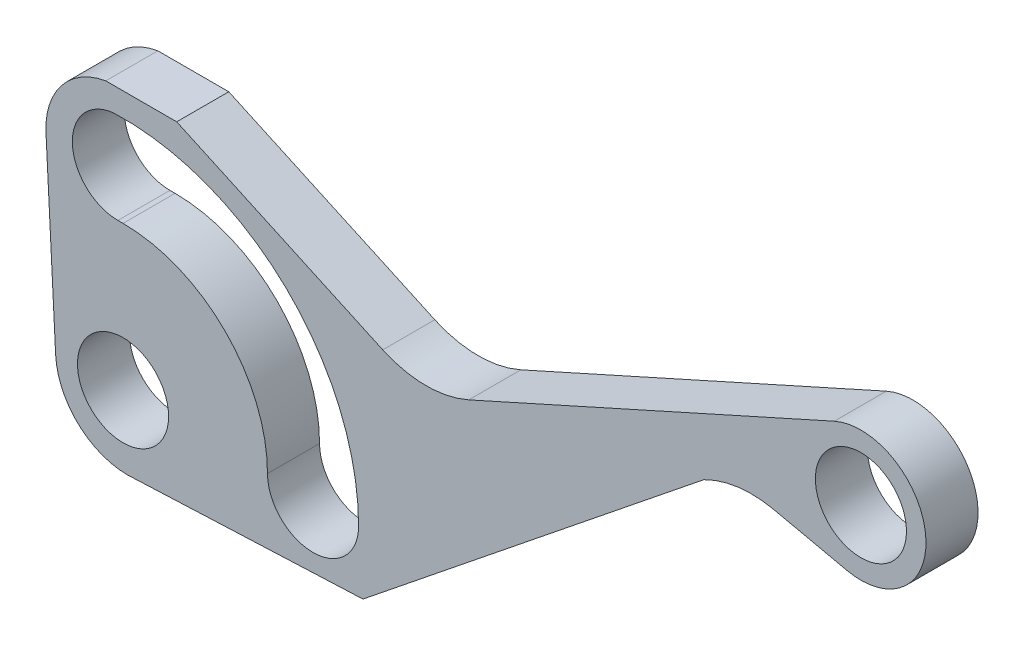
ISO-10303-21;
HEADER;
FILE_DESCRIPTION(('STEP AP214'),'2;1');
FILE_NAME('part.step','',(''),(''),'','','');
FILE_SCHEMA(('AUTOMOTIVE_DESIGN { 1 0 10303 214 1 1 1 1 }'));
ENDSEC;
DATA;
#1=APPLICATION_CONTEXT('core data for automotive mechanical design processes');
#2=APPLICATION_PROTOCOL_DEFINITION('international standard','automotive_design',2000,#1);
#3=PRODUCT_CONTEXT('',#1,'mechanical');
#4=PRODUCT('Part','Part','',(#3));
#5=PRODUCT_RELATED_PRODUCT_CATEGORY('part','',(#4));
#6=PRODUCT_DEFINITION_FORMATION('','',#4);
#7=PRODUCT_DEFINITION_CONTEXT('part definition',#1,'design');
#8=PRODUCT_DEFINITION('design','',#6,#7);
#9=PRODUCT_DEFINITION_SHAPE('','',#8);
#10=(LENGTH_UNIT() NAMED_UNIT(*) SI_UNIT(.MILLI.,.METRE.));
#11=(NAMED_UNIT(*) PLANE_ANGLE_UNIT() SI_UNIT($,.RADIAN.));
#12=(NAMED_UNIT(*) SI_UNIT($,.STERADIAN.) SOLID_ANGLE_UNIT());
#13=UNCERTAINTY_MEASURE_WITH_UNIT(LENGTH_MEASURE(1.E-05),#10,'distance_accuracy_value','');
#14=(GEOMETRIC_REPRESENTATION_CONTEXT(3) GLOBAL_UNCERTAINTY_ASSIGNED_CONTEXT((#13)) GLOBAL_UNIT_ASSIGNED_CONTEXT((#10,
#11,#12)) REPRESENTATION_CONTEXT('',''));
#15=CARTESIAN_POINT('',(0.,0.,0.));
#16=DIRECTION('',(0.,0.,1.));
#17=DIRECTION('',(1.,0.,0.));
#18=AXIS2_PLACEMENT_3D('',#15,#16,#17);
#19=CARTESIAN_POINT('',(-10.278907768874,-4.48742178779802,3.));
#20=DIRECTION('',(0.,0.,-1.));
#21=DIRECTION('',(-1.,0.,0.));
#22=AXIS2_PLACEMENT_3D('',#19,#20,#21);
#23=CYLINDRICAL_SURFACE('',#22,18.0994140174849);
#24=CARTESIAN_POINT('',(-10.278907768874,-4.48742178779802,-1.));
#25=DIRECTION('',(0.,0.,1.));
#26=DIRECTION('',(1.,0.,0.));
#27=AXIS2_PLACEMENT_3D('',#24,#25,#26);
#28=CIRCLE('',#27,18.0994140174849);
#29=CARTESIAN_POINT('',(7.82036578510986,-4.41611544594141,-1.));
#30=VERTEX_POINT('',#29);
#31=CARTESIAN_POINT('',(-10.9936081008676,13.5978758655937,-1.));
#32=VERTEX_POINT('',#31);
#33=EDGE_CURVE('E232',#30,#32,#28,.T.);
#34=ORIENTED_EDGE('',*,*,#33,.F.);
#35=DIRECTION('',(0.,0.,-1.));
#36=VECTOR('',#35,1.);
#37=CARTESIAN_POINT('',(7.82036578510986,-4.41611544594141,3.));
#38=LINE('',#37,#36);
#39=CARTESIAN_POINT('',(7.82036578510986,-4.41611544594141,3.));
#40=VERTEX_POINT('',#39);
#41=EDGE_CURVE('E11',#40,#30,#38,.T.);
#42=ORIENTED_EDGE('',*,*,#41,.F.);
#43=CARTESIAN_POINT('',(-10.278907768874,-4.48742178779802,3.));
#44=DIRECTION('',(0.,0.,1.));
#45=DIRECTION('',(1.,0.,0.));
#46=AXIS2_PLACEMENT_3D('',#43,#44,#45);
#47=CIRCLE('',#46,18.0994140174849);
#48=CARTESIAN_POINT('',(-10.9936081008676,13.5978758655937,3.));
#49=VERTEX_POINT('',#48);
#50=EDGE_CURVE('E529',#40,#49,#47,.T.);
#51=ORIENTED_EDGE('',*,*,#50,.T.);
#52=DIRECTION('',(0.,0.,-1.));
#53=VECTOR('',#52,1.);
#54=CARTESIAN_POINT('',(-10.9936081008676,13.5978758655937,3.));
#55=LINE('',#54,#53);
#56=EDGE_CURVE('E56',#49,#32,#55,.T.);
#57=ORIENTED_EDGE('',*,*,#56,.T.);
#58=EDGE_LOOP('',(#34,#42,#51,#57));
#59=FACE_BOUND('',#58,.T.);
#60=ADVANCED_FACE('F37',(#59),#23,.F.);
#61=CARTESIAN_POINT('',(4.32109223112603,-4.48742178779802,3.));
#62=DIRECTION('',(0.,0.,-1.));
#63=DIRECTION('',(-1.,0.,0.));
#64=AXIS2_PLACEMENT_3D('',#61,#62,#63);
#65=CYLINDRICAL_SURFACE('',#64,3.49999999999994);
#66=CARTESIAN_POINT('',(4.32109223112603,-4.48742178779802,-1.));
#67=DIRECTION('',(0.,0.,1.));
#68=DIRECTION('',(1.,0.,0.));
#69=AXIS2_PLACEMENT_3D('',#66,#67,#68);
#70=CIRCLE('',#69,3.49999999999994);
#71=CARTESIAN_POINT('',(0.821092231126088,-4.48742178779802,-1.));
#72=VERTEX_POINT('',#71);
#73=EDGE_CURVE('E234',#72,#30,#70,.T.);
#74=ORIENTED_EDGE('',*,*,#73,.F.);
#75=DIRECTION('',(0.,0.,-1.));
#76=VECTOR('',#75,1.);
#77=CARTESIAN_POINT('',(0.821092231126088,-4.48742178779802,3.));
#78=LINE('',#77,#76);
#79=CARTESIAN_POINT('',(0.821092231126088,-4.48742178779802,3.));
#80=VERTEX_POINT('',#79);
#81=EDGE_CURVE('E47',#80,#72,#78,.T.);
#82=ORIENTED_EDGE('',*,*,#81,.F.);
#83=CARTESIAN_POINT('',(4.32109223112603,-4.48742178779802,3.));
#84=DIRECTION('',(0.,0.,1.));
#85=DIRECTION('',(1.,0.,0.));
#86=AXIS2_PLACEMENT_3D('',#83,#84,#85);
#87=CIRCLE('',#86,3.49999999999994);
#88=EDGE_CURVE('E173',#80,#40,#87,.T.);
#89=ORIENTED_EDGE('',*,*,#88,.T.);
#90=ORIENTED_EDGE('',*,*,#41,.T.);
#91=EDGE_LOOP('',(#74,#82,#89,#90));
#92=FACE_BOUND('',#91,.T.);
#93=ADVANCED_FACE('F343',(#92),#65,.F.);
#94=CARTESIAN_POINT('',(-10.278907768874,-4.48742178779802,3.));
#95=DIRECTION('',(0.,0.,-1.));
#96=DIRECTION('',(-1.,0.,0.));
#97=AXIS2_PLACEMENT_3D('',#94,#95,#96);
#98=CYLINDRICAL_SURFACE('',#97,11.1000000000001);
#99=CARTESIAN_POINT('',(-10.278907768874,-4.48742178779802,-1.));
#100=DIRECTION('',(0.,0.,1.));
#101=DIRECTION('',(1.,0.,0.));
#102=AXIS2_PLACEMENT_3D('',#99,#100,#101);
#103=CIRCLE('',#102,11.1000000000001);
#104=CARTESIAN_POINT('',(-10.2789077688739,6.61257821220198,-1.));
#105=VERTEX_POINT('',#104);
#106=EDGE_CURVE('E180',#72,#105,#103,.T.);
#107=ORIENTED_EDGE('',*,*,#106,.T.);
#108=DIRECTION('',(0.,0.,-1.));
#109=VECTOR('',#108,1.);
#110=CARTESIAN_POINT('',(-10.2789077688739,6.61257821220198,3.));
#111=LINE('',#110,#109);
#112=CARTESIAN_POINT('',(-10.2789077688739,6.61257821220198,3.));
#113=VERTEX_POINT('',#112);
#114=EDGE_CURVE('E177',#113,#105,#111,.T.);
#115=ORIENTED_EDGE('',*,*,#114,.F.);
#116=CARTESIAN_POINT('',(-10.278907768874,-4.48742178779802,3.));
#117=DIRECTION('',(0.,0.,1.));
#118=DIRECTION('',(1.,0.,0.));
#119=AXIS2_PLACEMENT_3D('',#116,#117,#118);
#120=CIRCLE('',#119,11.1000000000001);
#121=EDGE_CURVE('E164',#80,#113,#120,.T.);
#122=ORIENTED_EDGE('',*,*,#121,.F.);
#123=ORIENTED_EDGE('',*,*,#81,.T.);
#124=EDGE_LOOP('',(#107,#115,#122,#123));
#125=FACE_BOUND('',#124,.T.);
#126=ADVANCED_FACE('F178',(#125),#98,.T.);
#127=CARTESIAN_POINT('',(-10.2789077688739,6.61257821220198,3.));
#128=DIRECTION('',(0.,1.,0.));
#129=DIRECTION('',(-1.,0.,0.));
#130=AXIS2_PLACEMENT_3D('',#127,#128,#129);
#131=PLANE('',#130);
#132=DIRECTION('',(1.,0.,0.));
#133=VECTOR('',#132,1.);
#134=CARTESIAN_POINT('',(-10.2789077688739,6.61257821220198,-1.));
#135=LINE('',#134,#133);
#136=CARTESIAN_POINT('',(-10.6731392767024,6.61257821220198,-1.));
#137=VERTEX_POINT('',#136);
#138=EDGE_CURVE('E238',#137,#105,#135,.T.);
#139=ORIENTED_EDGE('',*,*,#138,.F.);
#140=DIRECTION('',(0.,0.,-1.));
#141=VECTOR('',#140,1.);
#142=CARTESIAN_POINT('',(-10.6731392767024,6.61257821220198,3.));
#143=LINE('',#142,#141);
#144=CARTESIAN_POINT('',(-10.6731392767024,6.61257821220198,3.));
#145=VERTEX_POINT('',#144);
#146=EDGE_CURVE('E108',#145,#137,#143,.T.);
#147=ORIENTED_EDGE('',*,*,#146,.F.);
#148=DIRECTION('',(1.,0.,0.));
#149=VECTOR('',#148,1.);
#150=CARTESIAN_POINT('',(-10.2789077688739,6.61257821220198,3.));
#151=LINE('',#150,#149);
#152=EDGE_CURVE('E171',#145,#113,#151,.T.);
#153=ORIENTED_EDGE('',*,*,#152,.T.);
#154=ORIENTED_EDGE('',*,*,#114,.T.);
#155=EDGE_LOOP('',(#139,#147,#153,#154));
#156=FACE_BOUND('',#155,.T.);
#157=ADVANCED_FACE('F184',(#156),#131,.T.);
#158=CARTESIAN_POINT('',(-10.6780760391979,9.98460003114458,3.));
#159=DIRECTION('',(0.,0.,-1.));
#160=DIRECTION('',(-1.,0.,0.));
#161=AXIS2_PLACEMENT_3D('',#158,#159,#160);
#162=CYLINDRICAL_SURFACE('',#161,5.5274829677151);
#163=CARTESIAN_POINT('',(-10.6780760391979,9.98460003114458,-1.));
#164=DIRECTION('',(0.,0.,1.));
#165=DIRECTION('',(1.,0.,0.));
#166=AXIS2_PLACEMENT_3D('',#163,#164,#165);
#167=CIRCLE('',#166,5.5274829677151);
#168=CARTESIAN_POINT('',(-16.1982813937467,9.70104967937128,-1.));
#169=VERTEX_POINT('',#168);
#170=CARTESIAN_POINT('',(-11.6043072413043,15.4339269362426,-1.));
#171=VERTEX_POINT('',#170);
#172=EDGE_CURVE('E197',#169,#171,#167,.F.);
#173=ORIENTED_EDGE('',*,*,#172,.F.);
#174=DIRECTION('',(0.,0.,-1.));
#175=VECTOR('',#174,1.);
#176=CARTESIAN_POINT('',(-16.1982813937467,9.70104967937128,3.));
#177=LINE('',#176,#175);
#178=CARTESIAN_POINT('',(-16.1982813937467,9.70104967937128,3.));
#179=VERTEX_POINT('',#178);
#180=EDGE_CURVE('E41',#179,#169,#177,.T.);
#181=ORIENTED_EDGE('',*,*,#180,.F.);
#182=CARTESIAN_POINT('',(-10.6780760391979,9.98460003114458,3.));
#183=DIRECTION('',(0.,0.,1.));
#184=DIRECTION('',(1.,0.,0.));
#185=AXIS2_PLACEMENT_3D('',#182,#183,#184);
#186=CIRCLE('',#185,5.5274829677151);
#187=CARTESIAN_POINT('',(-11.6043072413043,15.4339269362426,3.));
#188=VERTEX_POINT('',#187);
#189=EDGE_CURVE('E249',#179,#188,#186,.F.);
#190=ORIENTED_EDGE('',*,*,#189,.T.);
#191=DIRECTION('',(0.,0.,-1.));
#192=VECTOR('',#191,1.);
#193=CARTESIAN_POINT('',(-11.6043072413043,15.4339269362426,3.));
#194=LINE('',#193,#192);
#195=EDGE_CURVE('E196',#188,#171,#194,.T.);
#196=ORIENTED_EDGE('',*,*,#195,.T.);
#197=EDGE_LOOP('',(#173,#181,#190,#196));
#198=FACE_BOUND('',#197,.T.);
#199=ADVANCED_FACE('F39',(#198),#162,.T.);
#200=CARTESIAN_POINT('',(-15.4558186424934,-4.75333850738242,3.));
#201=DIRECTION('',(0.998683376645616,0.051298276888317,0.));
#202=DIRECTION('',(-0.051298276888317,0.998683376645616,0.));
#203=AXIS2_PLACEMENT_3D('',#200,#201,#202);
#204=PLANE('',#203);
#205=DIRECTION('',(0.051298276888317,-0.998683376645616,0.));
#206=VECTOR('',#205,1.);
#207=CARTESIAN_POINT('',(-15.4558186424934,-4.75333850738242,-1.));
#208=LINE('',#207,#206);
#209=CARTESIAN_POINT('',(-15.4579295632633,-4.71224275114651,-1.));
#210=VERTEX_POINT('',#209);
#211=EDGE_CURVE('E200',#169,#210,#208,.T.);
#212=ORIENTED_EDGE('',*,*,#211,.T.);
#213=DIRECTION('',(0.,0.,-1.));
#214=VECTOR('',#213,1.);
#215=CARTESIAN_POINT('',(-15.4579295632633,-4.71224275114651,3.));
#216=LINE('',#215,#214);
#217=CARTESIAN_POINT('',(-15.4579295632633,-4.71224275114651,3.));
#218=VERTEX_POINT('',#217);
#219=EDGE_CURVE('E271',#218,#210,#216,.T.);
#220=ORIENTED_EDGE('',*,*,#219,.F.);
#221=DIRECTION('',(0.051298276888317,-0.998683376645616,0.));
#222=VECTOR('',#221,1.);
#223=CARTESIAN_POINT('',(-15.4558186424934,-4.75333850738242,3.));
#224=LINE('',#223,#222);
#225=EDGE_CURVE('E280',#179,#218,#224,.T.);
#226=ORIENTED_EDGE('',*,*,#225,.F.);
#227=ORIENTED_EDGE('',*,*,#180,.T.);
#228=EDGE_LOOP('',(#212,#220,#226,#227));
#229=FACE_BOUND('',#228,.T.);
#230=ADVANCED_FACE('F279',(#229),#204,.F.);
#231=CARTESIAN_POINT('',(-9.93772420871442,-4.4286923993732,3.));
#232=DIRECTION('',(0.,0.,-1.));
#233=DIRECTION('',(-1.,0.,0.));
#234=AXIS2_PLACEMENT_3D('',#231,#232,#233);
#235=CYLINDRICAL_SURFACE('',#234,5.5274829677151);
#236=CARTESIAN_POINT('',(-9.93772420871442,-4.4286923993732,-1.));
#237=DIRECTION('',(0.,0.,1.));
#238=DIRECTION('',(1.,0.,0.));
#239=AXIS2_PLACEMENT_3D('',#236,#237,#238);
#240=CIRCLE('',#239,5.5274829677151);
#241=CARTESIAN_POINT('',(-9.93772420871442,-9.9561753670883,-1.));
#242=VERTEX_POINT('',#241);
#243=EDGE_CURVE('E202',#210,#242,#240,.T.);
#244=ORIENTED_EDGE('',*,*,#243,.T.);
#245=DIRECTION('',(0.,0.,-1.));
#246=VECTOR('',#245,1.);
#247=CARTESIAN_POINT('',(-9.93772420871442,-9.9561753670883,3.));
#248=LINE('',#247,#246);
#249=CARTESIAN_POINT('',(-9.93772420871442,-9.9561753670883,3.));
#250=VERTEX_POINT('',#249);
#251=EDGE_CURVE('E270',#250,#242,#248,.T.);
#252=ORIENTED_EDGE('',*,*,#251,.F.);
#253=CARTESIAN_POINT('',(-9.93772420871442,-4.4286923993732,3.));
#254=DIRECTION('',(0.,0.,1.));
#255=DIRECTION('',(1.,0.,0.));
#256=AXIS2_PLACEMENT_3D('',#253,#254,#255);
#257=CIRCLE('',#256,5.5274829677151);
#258=EDGE_CURVE('E512',#218,#250,#257,.T.);
#259=ORIENTED_EDGE('',*,*,#258,.F.);
#260=ORIENTED_EDGE('',*,*,#219,.T.);
#261=EDGE_LOOP('',(#244,#252,#259,#260));
#262=FACE_BOUND('',#261,.T.);
#263=ADVANCED_FACE('F334',(#262),#235,.T.);
#264=CARTESIAN_POINT('',(-10.0414107976076,-9.96067456561297,3.));
#265=DIRECTION('',(0.0433514960330222,-0.999059881984908,0.));
#266=DIRECTION('',(0.999059881984908,0.0433514960330222,0.));
#267=AXIS2_PLACEMENT_3D('',#264,#265,#266);
#268=PLANE('',#267);
#269=DIRECTION('',(-0.999059881984908,-0.0433514960330222,0.));
#270=VECTOR('',#269,1.);
#271=CARTESIAN_POINT('',(-10.0414107976076,-9.96067456561297,-1.));
#272=LINE('',#271,#270);
#273=CARTESIAN_POINT('',(8.15797388959057,-9.17096158914652,-1.));
#274=VERTEX_POINT('',#273);
#275=EDGE_CURVE('E205',#274,#242,#272,.T.);
#276=ORIENTED_EDGE('',*,*,#275,.F.);
#277=DIRECTION('',(0.,0.,-1.));
#278=VECTOR('',#277,1.);
#279=CARTESIAN_POINT('',(8.15797388959057,-9.17096158914652,3.));
#280=LINE('',#279,#278);
#281=CARTESIAN_POINT('',(8.15797388959057,-9.17096158914652,3.));
#282=VERTEX_POINT('',#281);
#283=EDGE_CURVE('E268',#282,#274,#280,.T.);
#284=ORIENTED_EDGE('',*,*,#283,.F.);
#285=DIRECTION('',(-0.999059881984908,-0.0433514960330222,0.));
#286=VECTOR('',#285,1.);
#287=CARTESIAN_POINT('',(-10.0414107976076,-9.96067456561297,3.));
#288=LINE('',#287,#286);
#289=EDGE_CURVE('E333',#282,#250,#288,.T.);
#290=ORIENTED_EDGE('',*,*,#289,.T.);
#291=ORIENTED_EDGE('',*,*,#251,.T.);
#292=EDGE_LOOP('',(#276,#284,#290,#291));
#293=FACE_BOUND('',#292,.T.);
#294=ADVANCED_FACE('F331',(#293),#268,.T.);
#295=CARTESIAN_POINT('',(-0.760855518449474,-16.3357036979346,3.));
#296=DIRECTION('',(0.626275611930927,-0.779601730308844,0.));
#297=DIRECTION('',(0.779601730308844,0.626275611930927,0.));
#298=AXIS2_PLACEMENT_3D('',#295,#296,#297);
#299=PLANE('',#298);
#300=DIRECTION('',(-0.779601730308844,-0.626275611930927,0.));
#301=VECTOR('',#300,1.);
#302=CARTESIAN_POINT('',(-0.760855518449474,-16.3357036979346,-1.));
#303=LINE('',#302,#301);
#304=CARTESIAN_POINT('',(34.3571013194445,11.8755214101768,-1.));
#305=VERTEX_POINT('',#304);
#306=EDGE_CURVE('E208',#305,#274,#303,.T.);
#307=ORIENTED_EDGE('',*,*,#306,.F.);
#308=DIRECTION('',(0.,0.,-1.));
#309=VECTOR('',#308,1.);
#310=CARTESIAN_POINT('',(34.3571013194445,11.8755214101768,3.));
#311=LINE('',#310,#309);
#312=CARTESIAN_POINT('',(34.3571013194445,11.8755214101768,3.));
#313=VERTEX_POINT('',#312);
#314=EDGE_CURVE('E266',#313,#305,#311,.T.);
#315=ORIENTED_EDGE('',*,*,#314,.F.);
#316=DIRECTION('',(-0.779601730308844,-0.626275611930927,0.));
#317=VECTOR('',#316,1.);
#318=CARTESIAN_POINT('',(-0.760855518449474,-16.3357036979346,3.));
#319=LINE('',#318,#317);
#320=EDGE_CURVE('E327',#313,#282,#319,.T.);
#321=ORIENTED_EDGE('',*,*,#320,.T.);
#322=ORIENTED_EDGE('',*,*,#283,.T.);
#323=EDGE_LOOP('',(#307,#315,#321,#322));
#324=FACE_BOUND('',#323,.T.);
#325=ADVANCED_FACE('F324',(#324),#299,.T.);
#326=CARTESIAN_POINT('',(38.0079075036656,4.75712171605639,3.));
#327=DIRECTION('',(0.,0.,-1.));
#328=DIRECTION('',(-1.,0.,0.));
#329=AXIS2_PLACEMENT_3D('',#326,#327,#328);
#330=CYLINDRICAL_SURFACE('',#329,8.);
#331=CARTESIAN_POINT('',(38.0079075036656,4.75712171605639,-1.));
#332=DIRECTION('',(0.,0.,1.));
#333=DIRECTION('',(1.,0.,0.));
#334=AXIS2_PLACEMENT_3D('',#331,#332,#333);
#335=CIRCLE('',#334,8.);
#336=CARTESIAN_POINT('',(39.7328067304173,12.5689539376003,-1.));
#337=VERTEX_POINT('',#336);
#338=EDGE_CURVE('E211',#337,#305,#335,.T.);
#339=ORIENTED_EDGE('',*,*,#338,.F.);
#340=DIRECTION('',(0.,0.,-1.));
#341=VECTOR('',#340,1.);
#342=CARTESIAN_POINT('',(39.7328067304173,12.5689539376003,3.));
#343=LINE('',#342,#341);
#344=CARTESIAN_POINT('',(39.7328067304173,12.5689539376003,3.));
#345=VERTEX_POINT('',#344);
#346=EDGE_CURVE('E264',#345,#337,#343,.T.);
#347=ORIENTED_EDGE('',*,*,#346,.F.);
#348=CARTESIAN_POINT('',(38.0079075036656,4.75712171605639,3.));
#349=DIRECTION('',(0.,0.,1.));
#350=DIRECTION('',(1.,0.,0.));
#351=AXIS2_PLACEMENT_3D('',#348,#349,#350);
#352=CIRCLE('',#351,8.);
#353=EDGE_CURVE('E518',#345,#313,#352,.T.);
#354=ORIENTED_EDGE('',*,*,#353,.T.);
#355=ORIENTED_EDGE('',*,*,#314,.T.);
#356=EDGE_LOOP('',(#339,#347,#354,#355));
#357=FACE_BOUND('',#356,.T.);
#358=ADVANCED_FACE('F320',(#357),#330,.F.);
#359=CARTESIAN_POINT('',(-4.36286152251806,22.3055409399199,3.));
#360=DIRECTION('',(-0.215612403343958,-0.976479027692987,0.));
#361=DIRECTION('',(0.976479027692988,-0.215612403343958,0.));
#362=AXIS2_PLACEMENT_3D('',#359,#360,#361);
#363=PLANE('',#362);
#364=DIRECTION('',(-0.976479027692988,0.215612403343958,0.));
#365=VECTOR('',#364,1.);
#366=CARTESIAN_POINT('',(-4.36286152251806,22.3055409399199,-1.));
#367=LINE('',#366,#365);
#368=CARTESIAN_POINT('',(45.3430302144062,11.330183073737,-1.));
#369=VERTEX_POINT('',#368);
#370=EDGE_CURVE('E214',#369,#337,#367,.T.);
#371=ORIENTED_EDGE('',*,*,#370,.F.);
#372=DIRECTION('',(0.,0.,-1.));
#373=VECTOR('',#372,1.);
#374=CARTESIAN_POINT('',(45.3430302144062,11.330183073737,3.));
#375=LINE('',#374,#373);
#376=CARTESIAN_POINT('',(45.3430302144062,11.330183073737,3.));
#377=VERTEX_POINT('',#376);
#378=EDGE_CURVE('E262',#377,#369,#375,.T.);
#379=ORIENTED_EDGE('',*,*,#378,.F.);
#380=DIRECTION('',(-0.976479027692988,0.215612403343958,0.));
#381=VECTOR('',#380,1.);
#382=CARTESIAN_POINT('',(-4.36286152251806,22.3055409399199,3.));
#383=LINE('',#382,#381);
#384=EDGE_CURVE('E316',#377,#345,#383,.T.);
#385=ORIENTED_EDGE('',*,*,#384,.T.);
#386=ORIENTED_EDGE('',*,*,#346,.T.);
#387=EDGE_LOOP('',(#371,#379,#385,#386));
#388=FACE_BOUND('',#387,.T.);
#389=ADVANCED_FACE('F311',(#388),#363,.T.);
#390=CARTESIAN_POINT('',(46.421092231126,16.212578212202,3.));
#391=DIRECTION('',(0.,0.,-1.));
#392=DIRECTION('',(-1.,0.,0.));
#393=AXIS2_PLACEMENT_3D('',#390,#391,#392);
#394=CYLINDRICAL_SURFACE('',#393,5.);
#395=CARTESIAN_POINT('',(46.421092231126,16.212578212202,-1.));
#396=DIRECTION('',(0.,0.,1.));
#397=DIRECTION('',(1.,0.,0.));
#398=AXIS2_PLACEMENT_3D('',#395,#396,#397);
#399=CIRCLE('',#398,5.);
#400=CARTESIAN_POINT('',(44.3714450279444,20.7731643962895,-1.));
#401=VERTEX_POINT('',#400);
#402=EDGE_CURVE('E217',#369,#401,#399,.T.);
#403=ORIENTED_EDGE('',*,*,#402,.T.);
#404=DIRECTION('',(0.,0.,-1.));
#405=VECTOR('',#404,1.);
#406=CARTESIAN_POINT('',(44.3714450279444,20.7731643962895,3.));
#407=LINE('',#406,#405);
#408=CARTESIAN_POINT('',(44.3714450279444,20.7731643962895,3.));
#409=VERTEX_POINT('',#408);
#410=EDGE_CURVE('E260',#409,#401,#407,.T.);
#411=ORIENTED_EDGE('',*,*,#410,.F.);
#412=CARTESIAN_POINT('',(46.421092231126,16.212578212202,3.));
#413=DIRECTION('',(0.,0.,1.));
#414=DIRECTION('',(1.,0.,0.));
#415=AXIS2_PLACEMENT_3D('',#412,#413,#414);
#416=CIRCLE('',#415,5.);
#417=EDGE_CURVE('E521',#377,#409,#416,.T.);
#418=ORIENTED_EDGE('',*,*,#417,.F.);
#419=ORIENTED_EDGE('',*,*,#378,.T.);
#420=EDGE_LOOP('',(#403,#411,#418,#419));
#421=FACE_BOUND('',#420,.T.);
#422=ADVANCED_FACE('F364',(#421),#394,.T.);
#423=CARTESIAN_POINT('',(-10.5403720465675,-3.90564831447509,3.));
#424=DIRECTION('',(-0.409929440636329,0.912117236817497,0.));
#425=DIRECTION('',(-0.912117236817497,-0.409929440636329,0.));
#426=AXIS2_PLACEMENT_3D('',#423,#424,#425);
#427=PLANE('',#426);
#428=DIRECTION('',(0.912117236817497,0.409929440636329,0.));
#429=VECTOR('',#428,1.);
#430=CARTESIAN_POINT('',(-10.5403720465675,-3.90564831447509,-1.));
#431=LINE('',#430,#429);
#432=CARTESIAN_POINT('',(16.2912352779306,8.15318068023005,-1.));
#433=VERTEX_POINT('',#432);
#434=EDGE_CURVE('E220',#433,#401,#431,.T.);
#435=ORIENTED_EDGE('',*,*,#434,.F.);
#436=DIRECTION('',(0.,0.,-1.));
#437=VECTOR('',#436,1.);
#438=CARTESIAN_POINT('',(16.2912352779306,8.15318068023005,3.));
#439=LINE('',#438,#437);
#440=CARTESIAN_POINT('',(16.2912352779306,8.15318068023005,3.));
#441=VERTEX_POINT('',#440);
#442=EDGE_CURVE('E258',#441,#433,#439,.T.);
#443=ORIENTED_EDGE('',*,*,#442,.F.);
#444=DIRECTION('',(0.912117236817497,0.409929440636329,0.));
#445=VECTOR('',#444,1.);
#446=CARTESIAN_POINT('',(-10.5403720465675,-3.90564831447509,3.));
#447=LINE('',#446,#445);
#448=EDGE_CURVE('E523',#441,#409,#447,.T.);
#449=ORIENTED_EDGE('',*,*,#448,.T.);
#450=ORIENTED_EDGE('',*,*,#410,.T.);
#451=EDGE_LOOP('',(#435,#443,#449,#450));
#452=FACE_BOUND('',#451,.T.);
#453=ADVANCED_FACE('F305',(#452),#427,.T.);
#454=CARTESIAN_POINT('',(13.01179975284,15.45011857477,3.));
#455=DIRECTION('',(0.,0.,-1.));
#456=DIRECTION('',(-1.,0.,0.));
#457=AXIS2_PLACEMENT_3D('',#454,#455,#456);
#458=CYLINDRICAL_SURFACE('',#457,8.);
#459=CARTESIAN_POINT('',(13.01179975284,15.45011857477,-1.));
#460=DIRECTION('',(0.,0.,1.));
#461=DIRECTION('',(1.,0.,0.));
#462=AXIS2_PLACEMENT_3D('',#459,#460,#461);
#463=CIRCLE('',#462,8.);
#464=CARTESIAN_POINT('',(9.67868684934687,8.17754280187029,-1.));
#465=VERTEX_POINT('',#464);
#466=EDGE_CURVE('E223',#465,#433,#463,.T.);
#467=ORIENTED_EDGE('',*,*,#466,.F.);
#468=DIRECTION('',(0.,0.,-1.));
#469=VECTOR('',#468,1.);
#470=CARTESIAN_POINT('',(9.67868684934687,8.17754280187029,3.));
#471=LINE('',#470,#469);
#472=CARTESIAN_POINT('',(9.67868684934687,8.17754280187029,3.));
#473=VERTEX_POINT('',#472);
#474=EDGE_CURVE('E256',#473,#465,#471,.T.);
#475=ORIENTED_EDGE('',*,*,#474,.F.);
#476=CARTESIAN_POINT('',(13.01179975284,15.45011857477,3.));
#477=DIRECTION('',(0.,0.,1.));
#478=DIRECTION('',(1.,0.,0.));
#479=AXIS2_PLACEMENT_3D('',#476,#477,#478);
#480=CIRCLE('',#479,8.);
#481=EDGE_CURVE('E301',#473,#441,#480,.T.);
#482=ORIENTED_EDGE('',*,*,#481,.T.);
#483=ORIENTED_EDGE('',*,*,#442,.T.);
#484=EDGE_LOOP('',(#467,#475,#482,#483));
#485=FACE_BOUND('',#484,.T.);
#486=ADVANCED_FACE('F296',(#485),#458,.F.);
#487=CARTESIAN_POINT('',(-2.01758793075363,13.5380925726442,3.));
#488=DIRECTION('',(-0.416639112936635,-0.909071971612465,0.));
#489=DIRECTION('',(0.909071971612465,-0.416639112936635,0.));
#490=AXIS2_PLACEMENT_3D('',#487,#488,#489);
#491=PLANE('',#490);
#492=DIRECTION('',(-0.909071971612465,0.416639112936635,0.));
#493=VECTOR('',#492,1.);
#494=CARTESIAN_POINT('',(-2.01758793075363,13.5380925726442,-1.));
#495=LINE('',#494,#493);
#496=CARTESIAN_POINT('',(-6.15414119532709,15.4339269362426,-1.));
#497=VERTEX_POINT('',#496);
#498=EDGE_CURVE('E226',#465,#497,#495,.T.);
#499=ORIENTED_EDGE('',*,*,#498,.T.);
#500=DIRECTION('',(0.,0.,-1.));
#501=VECTOR('',#500,1.);
#502=CARTESIAN_POINT('',(-6.15414119532709,15.4339269362426,3.));
#503=LINE('',#502,#501);
#504=CARTESIAN_POINT('',(-6.15414119532709,15.4339269362426,3.));
#505=VERTEX_POINT('',#504);
#506=EDGE_CURVE('E254',#505,#497,#503,.T.);
#507=ORIENTED_EDGE('',*,*,#506,.F.);
#508=DIRECTION('',(-0.909071971612465,0.416639112936635,0.));
#509=VECTOR('',#508,1.);
#510=CARTESIAN_POINT('',(-2.01758793075363,13.5380925726442,3.));
#511=LINE('',#510,#509);
#512=EDGE_CURVE('E526',#473,#505,#511,.T.);
#513=ORIENTED_EDGE('',*,*,#512,.F.);
#514=ORIENTED_EDGE('',*,*,#474,.T.);
#515=EDGE_LOOP('',(#499,#507,#513,#514));
#516=FACE_BOUND('',#515,.T.);
#517=ADVANCED_FACE('F356',(#516),#491,.F.);
#518=CARTESIAN_POINT('',(46.421092231126,16.212578212202,3.));
#519=DIRECTION('',(0.,0.,-1.));
#520=DIRECTION('',(-1.,0.,0.));
#521=AXIS2_PLACEMENT_3D('',#518,#519,#520);
#522=CYLINDRICAL_SURFACE('',#521,3.5);
#523=CARTESIAN_POINT('',(46.421092231126,16.212578212202,3.));
#524=DIRECTION('',(0.,0.,1.));
#525=DIRECTION('',(1.,0.,0.));
#526=AXIS2_PLACEMENT_3D('',#523,#524,#525);
#527=CIRCLE('',#526,3.5);
#528=CARTESIAN_POINT('',(49.921092231126,16.212578212202,3.));
#529=VERTEX_POINT('',#528);
#530=EDGE_CURVE('E187',#529,#529,#527,.T.);
#531=ORIENTED_EDGE('',*,*,#530,.T.);
#532=EDGE_LOOP('',(#531));
#533=FACE_BOUND('',#532,.T.);
#534=CARTESIAN_POINT('',(46.421092231126,16.212578212202,-1.));
#535=DIRECTION('',(0.,0.,1.));
#536=DIRECTION('',(1.,0.,0.));
#537=AXIS2_PLACEMENT_3D('',#534,#535,#536);
#538=CIRCLE('',#537,3.5);
#539=CARTESIAN_POINT('',(49.921092231126,16.212578212202,-1.));
#540=VERTEX_POINT('',#539);
#541=EDGE_CURVE('E243',#540,#540,#538,.T.);
#542=ORIENTED_EDGE('',*,*,#541,.F.);
#543=EDGE_LOOP('',(#542));
#544=FACE_BOUND('',#543,.T.);
#545=ADVANCED_FACE('F359',(#533,#544),#522,.F.);
#546=CARTESIAN_POINT('',(-10.6731392767024,10.112578212202,3.));
#547=DIRECTION('',(0.,0.,-1.));
#548=DIRECTION('',(-1.,0.,0.));
#549=AXIS2_PLACEMENT_3D('',#546,#547,#548);
#550=CYLINDRICAL_SURFACE('',#549,3.5);
#551=CARTESIAN_POINT('',(-10.6731392767024,10.112578212202,-1.));
#552=DIRECTION('',(0.,0.,1.));
#553=DIRECTION('',(1.,0.,0.));
#554=AXIS2_PLACEMENT_3D('',#551,#552,#553);
#555=CIRCLE('',#554,3.5);
#556=EDGE_CURVE('E240',#32,#137,#555,.T.);
#557=ORIENTED_EDGE('',*,*,#556,.F.);
#558=ORIENTED_EDGE('',*,*,#56,.F.);
#559=CARTESIAN_POINT('',(-10.6731392767024,10.112578212202,3.));
#560=DIRECTION('',(0.,0.,1.));
#561=DIRECTION('',(1.,0.,0.));
#562=AXIS2_PLACEMENT_3D('',#559,#560,#561);
#563=CIRCLE('',#562,3.5);
#564=EDGE_CURVE('E185',#49,#145,#563,.T.);
#565=ORIENTED_EDGE('',*,*,#564,.T.);
#566=ORIENTED_EDGE('',*,*,#146,.T.);
#567=EDGE_LOOP('',(#557,#558,#565,#566));
#568=FACE_BOUND('',#567,.T.);
#569=ADVANCED_FACE('F355',(#568),#550,.F.);
#570=CARTESIAN_POINT('',(-10.278907768874,15.4339269362426,3.));
#571=DIRECTION('',(0.,1.,0.));
#572=DIRECTION('',(0.,0.,1.));
#573=AXIS2_PLACEMENT_3D('',#570,#571,#572);
#574=PLANE('',#573);
#575=DIRECTION('',(1.,0.,0.));
#576=VECTOR('',#575,1.);
#577=CARTESIAN_POINT('',(-10.278907768874,15.4339269362426,-1.));
#578=LINE('',#577,#576);
#579=EDGE_CURVE('E229',#171,#497,#578,.T.);
#580=ORIENTED_EDGE('',*,*,#579,.F.);
#581=ORIENTED_EDGE('',*,*,#195,.F.);
#582=DIRECTION('',(1.,0.,0.));
#583=VECTOR('',#582,1.);
#584=CARTESIAN_POINT('',(-10.278907768874,15.4339269362426,3.));
#585=LINE('',#584,#583);
#586=EDGE_CURVE('E290',#188,#505,#585,.T.);
#587=ORIENTED_EDGE('',*,*,#586,.T.);
#588=ORIENTED_EDGE('',*,*,#506,.T.);
#589=EDGE_LOOP('',(#580,#581,#587,#588));
#590=FACE_BOUND('',#589,.T.);
#591=ADVANCED_FACE('F289',(#590),#574,.T.);
#592=CARTESIAN_POINT('',(-10.278907768874,-4.48742178779802,3.));
#593=DIRECTION('',(0.,0.,-1.));
#594=DIRECTION('',(-1.,0.,0.));
#595=AXIS2_PLACEMENT_3D('',#592,#593,#594);
#596=CYLINDRICAL_SURFACE('',#595,3.5);
#597=CARTESIAN_POINT('',(-10.278907768874,-4.48742178779802,3.));
#598=DIRECTION('',(0.,0.,1.));
#599=DIRECTION('',(1.,0.,0.));
#600=AXIS2_PLACEMENT_3D('',#597,#598,#599);
#601=CIRCLE('',#600,3.5);
#602=CARTESIAN_POINT('',(-6.77890776887397,-4.48742178779802,3.));
#603=VERTEX_POINT('',#602);
#604=EDGE_CURVE('E193',#603,#603,#601,.T.);
#605=ORIENTED_EDGE('',*,*,#604,.T.);
#606=EDGE_LOOP('',(#605));
#607=FACE_BOUND('',#606,.T.);
#608=CARTESIAN_POINT('',(-10.278907768874,-4.48742178779802,-1.));
#609=DIRECTION('',(0.,0.,1.));
#610=DIRECTION('',(1.,0.,0.));
#611=AXIS2_PLACEMENT_3D('',#608,#609,#610);
#612=CIRCLE('',#611,3.5);
#613=CARTESIAN_POINT('',(-6.77890776887397,-4.48742178779802,-1.));
#614=VERTEX_POINT('',#613);
#615=EDGE_CURVE('E246',#614,#614,#612,.T.);
#616=ORIENTED_EDGE('',*,*,#615,.F.);
#617=EDGE_LOOP('',(#616));
#618=FACE_BOUND('',#617,.T.);
#619=ADVANCED_FACE('F354',(#607,#618),#596,.F.);
#620=CARTESIAN_POINT('',(-10.278907768874,-4.48742178779802,3.));
#621=DIRECTION('',(0.,0.,1.));
#622=DIRECTION('',(1.,0.,0.));
#623=AXIS2_PLACEMENT_3D('',#620,#621,#622);
#624=PLANE('',#623);
#625=ORIENTED_EDGE('',*,*,#189,.F.);
#626=ORIENTED_EDGE('',*,*,#225,.T.);
#627=ORIENTED_EDGE('',*,*,#258,.T.);
#628=ORIENTED_EDGE('',*,*,#289,.F.);
#629=ORIENTED_EDGE('',*,*,#320,.F.);
#630=ORIENTED_EDGE('',*,*,#353,.F.);
#631=ORIENTED_EDGE('',*,*,#384,.F.);
#632=ORIENTED_EDGE('',*,*,#417,.T.);
#633=ORIENTED_EDGE('',*,*,#448,.F.);
#634=ORIENTED_EDGE('',*,*,#481,.F.);
#635=ORIENTED_EDGE('',*,*,#512,.T.);
#636=ORIENTED_EDGE('',*,*,#586,.F.);
#637=EDGE_LOOP('',(#625,#626,#627,#628,#629,#630,#631,#632,#633,#634,#635,#636));
#638=FACE_BOUND('',#637,.T.);
#639=ORIENTED_EDGE('',*,*,#50,.F.);
#640=ORIENTED_EDGE('',*,*,#88,.F.);
#641=ORIENTED_EDGE('',*,*,#121,.T.);
#642=ORIENTED_EDGE('',*,*,#152,.F.);
#643=ORIENTED_EDGE('',*,*,#564,.F.);
#644=EDGE_LOOP('',(#639,#640,#641,#642,#643));
#645=FACE_BOUND('',#644,.T.);
#646=ORIENTED_EDGE('',*,*,#530,.F.);
#647=EDGE_LOOP('',(#646));
#648=FACE_BOUND('',#647,.T.);
#649=ORIENTED_EDGE('',*,*,#604,.F.);
#650=EDGE_LOOP('',(#649));
#651=FACE_BOUND('',#650,.T.);
#652=ADVANCED_FACE('F167',(#638,#645,#648,#651),#624,.T.);
#653=CARTESIAN_POINT('',(-10.278907768874,-4.48742178779802,-1.));
#654=DIRECTION('',(0.,0.,1.));
#655=DIRECTION('',(1.,0.,0.));
#656=AXIS2_PLACEMENT_3D('',#653,#654,#655);
#657=PLANE('',#656);
#658=ORIENTED_EDGE('',*,*,#172,.T.);
#659=ORIENTED_EDGE('',*,*,#579,.T.);
#660=ORIENTED_EDGE('',*,*,#498,.F.);
#661=ORIENTED_EDGE('',*,*,#466,.T.);
#662=ORIENTED_EDGE('',*,*,#434,.T.);
#663=ORIENTED_EDGE('',*,*,#402,.F.);
#664=ORIENTED_EDGE('',*,*,#370,.T.);
#665=ORIENTED_EDGE('',*,*,#338,.T.);
#666=ORIENTED_EDGE('',*,*,#306,.T.);
#667=ORIENTED_EDGE('',*,*,#275,.T.);
#668=ORIENTED_EDGE('',*,*,#243,.F.);
#669=ORIENTED_EDGE('',*,*,#211,.F.);
#670=EDGE_LOOP('',(#658,#659,#660,#661,#662,#663,#664,#665,#666,#667,#668,#669));
#671=FACE_BOUND('',#670,.T.);
#672=ORIENTED_EDGE('',*,*,#33,.T.);
#673=ORIENTED_EDGE('',*,*,#556,.T.);
#674=ORIENTED_EDGE('',*,*,#138,.T.);
#675=ORIENTED_EDGE('',*,*,#106,.F.);
#676=ORIENTED_EDGE('',*,*,#73,.T.);
#677=EDGE_LOOP('',(#672,#673,#674,#675,#676));
#678=FACE_BOUND('',#677,.T.);
#679=ORIENTED_EDGE('',*,*,#541,.T.);
#680=EDGE_LOOP('',(#679));
#681=FACE_BOUND('',#680,.T.);
#682=ORIENTED_EDGE('',*,*,#615,.T.);
#683=EDGE_LOOP('',(#682));
#684=FACE_BOUND('',#683,.T.);
#685=ADVANCED_FACE('F283',(#671,#678,#681,#684),#657,.F.);
#686=CLOSED_SHELL('',(#60,#93,#126,#157,#199,#230,#263,#294,#325,#358,#389,#422,#453,#486,#517,
#545,#569,#591,#619,#652,#685));
#687=MANIFOLD_SOLID_BREP('B2',#686);
#688=ADVANCED_BREP_SHAPE_REPRESENTATION('',(#18,#687),#14);
#689=SHAPE_DEFINITION_REPRESENTATION(#9,#688);
ENDSEC;
END-ISO-10303-21;
